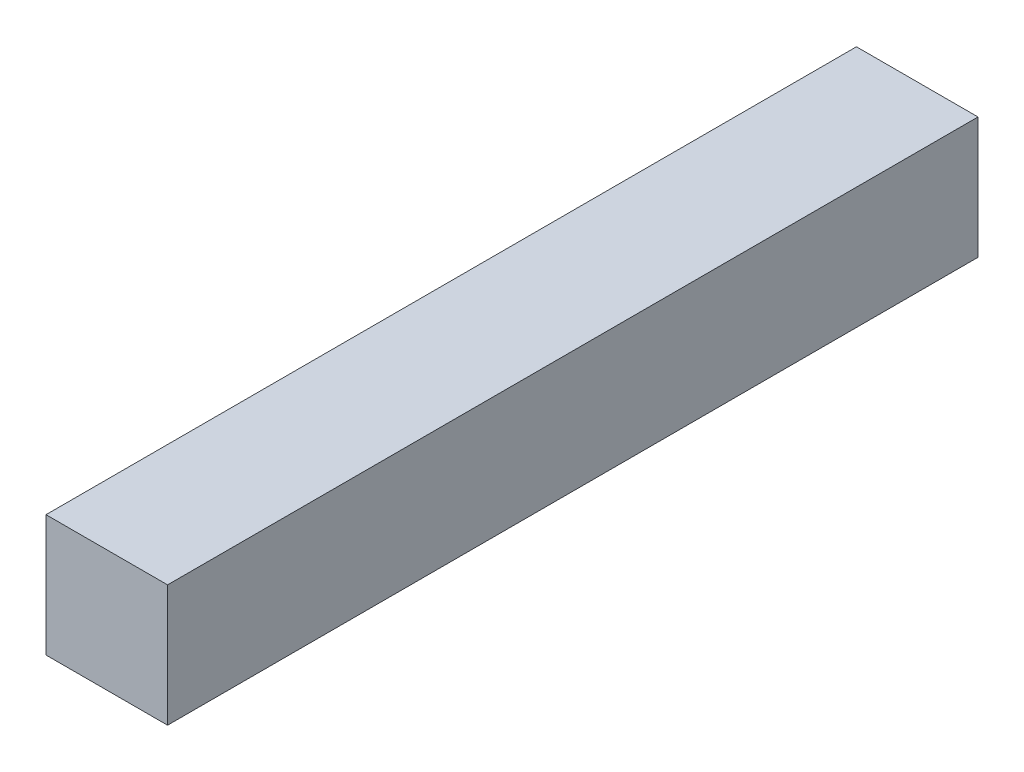
ISO-10303-21;
HEADER;
FILE_DESCRIPTION(('STEP AP214'),'2;1');
FILE_NAME('part.step','',(''),(''),'','','');
FILE_SCHEMA(('AUTOMOTIVE_DESIGN { 1 0 10303 214 1 1 1 1 }'));
ENDSEC;
DATA;
#1=APPLICATION_CONTEXT('core data for automotive mechanical design processes');
#2=APPLICATION_PROTOCOL_DEFINITION('international standard','automotive_design',2000,#1);
#3=PRODUCT_CONTEXT('',#1,'mechanical');
#4=PRODUCT('Part','Part','',(#3));
#5=PRODUCT_RELATED_PRODUCT_CATEGORY('part','',(#4));
#6=PRODUCT_DEFINITION_FORMATION('','',#4);
#7=PRODUCT_DEFINITION_CONTEXT('part definition',#1,'design');
#8=PRODUCT_DEFINITION('design','',#6,#7);
#9=PRODUCT_DEFINITION_SHAPE('','',#8);
#10=(LENGTH_UNIT() NAMED_UNIT(*) SI_UNIT(.MILLI.,.METRE.));
#11=(NAMED_UNIT(*) PLANE_ANGLE_UNIT() SI_UNIT($,.RADIAN.));
#12=(NAMED_UNIT(*) SI_UNIT($,.STERADIAN.) SOLID_ANGLE_UNIT());
#13=UNCERTAINTY_MEASURE_WITH_UNIT(LENGTH_MEASURE(1.E-05),#10,'distance_accuracy_value','');
#14=(GEOMETRIC_REPRESENTATION_CONTEXT(3) GLOBAL_UNCERTAINTY_ASSIGNED_CONTEXT((#13)) GLOBAL_UNIT_ASSIGNED_CONTEXT((#10,
#11,#12)) REPRESENTATION_CONTEXT('',''));
#15=CARTESIAN_POINT('',(0.,0.,0.));
#16=DIRECTION('',(0.,0.,1.));
#17=DIRECTION('',(1.,0.,0.));
#18=AXIS2_PLACEMENT_3D('',#15,#16,#17);
#19=CARTESIAN_POINT('',(2.38125,-2.38125,31.75));
#20=DIRECTION('',(-1.,0.,0.));
#21=DIRECTION('',(0.,0.,1.));
#22=AXIS2_PLACEMENT_3D('',#19,#20,#21);
#23=PLANE('',#22);
#24=DIRECTION('',(0.,1.,0.));
#25=VECTOR('',#24,1.);
#26=CARTESIAN_POINT('',(2.38125,-2.38125,0.));
#27=LINE('',#26,#25);
#28=CARTESIAN_POINT('',(2.38125,-2.38125,0.));
#29=VERTEX_POINT('',#28);
#30=CARTESIAN_POINT('',(2.38125,2.38125,0.));
#31=VERTEX_POINT('',#30);
#32=EDGE_CURVE('E96',#29,#31,#27,.T.);
#33=ORIENTED_EDGE('',*,*,#32,.T.);
#34=DIRECTION('',(0.,0.,-1.));
#35=VECTOR('',#34,1.);
#36=CARTESIAN_POINT('',(2.38125,2.38125,31.75));
#37=LINE('',#36,#35);
#38=CARTESIAN_POINT('',(2.38125,2.38125,31.75));
#39=VERTEX_POINT('',#38);
#40=EDGE_CURVE('E11',#39,#31,#37,.T.);
#41=ORIENTED_EDGE('',*,*,#40,.F.);
#42=DIRECTION('',(0.,1.,0.));
#43=VECTOR('',#42,1.);
#44=CARTESIAN_POINT('',(2.38125,-2.38125,31.75));
#45=LINE('',#44,#43);
#46=CARTESIAN_POINT('',(2.38125,-2.38125,31.75));
#47=VERTEX_POINT('',#46);
#48=EDGE_CURVE('E84',#47,#39,#45,.T.);
#49=ORIENTED_EDGE('',*,*,#48,.F.);
#50=DIRECTION('',(0.,0.,-1.));
#51=VECTOR('',#50,1.);
#52=CARTESIAN_POINT('',(2.38125,-2.38125,31.75));
#53=LINE('',#52,#51);
#54=EDGE_CURVE('E92',#47,#29,#53,.T.);
#55=ORIENTED_EDGE('',*,*,#54,.T.);
#56=EDGE_LOOP('',(#33,#41,#49,#55));
#57=FACE_BOUND('',#56,.T.);
#58=ADVANCED_FACE('F33',(#57),#23,.F.);
#59=CARTESIAN_POINT('',(-2.38125,2.38125,31.75));
#60=DIRECTION('',(0.,-1.,0.));
#61=DIRECTION('',(0.,0.,-1.));
#62=AXIS2_PLACEMENT_3D('',#59,#60,#61);
#63=PLANE('',#62);
#64=DIRECTION('',(-1.,0.,0.));
#65=VECTOR('',#64,1.);
#66=CARTESIAN_POINT('',(-2.38125,2.38125,0.));
#67=LINE('',#66,#65);
#68=CARTESIAN_POINT('',(-2.38125,2.38125,0.));
#69=VERTEX_POINT('',#68);
#70=EDGE_CURVE('E88',#31,#69,#67,.T.);
#71=ORIENTED_EDGE('',*,*,#70,.T.);
#72=DIRECTION('',(0.,0.,-1.));
#73=VECTOR('',#72,1.);
#74=CARTESIAN_POINT('',(-2.38125,2.38125,31.75));
#75=LINE('',#74,#73);
#76=CARTESIAN_POINT('',(-2.38125,2.38125,31.75));
#77=VERTEX_POINT('',#76);
#78=EDGE_CURVE('E41',#77,#69,#75,.T.);
#79=ORIENTED_EDGE('',*,*,#78,.F.);
#80=DIRECTION('',(-1.,0.,0.));
#81=VECTOR('',#80,1.);
#82=CARTESIAN_POINT('',(-2.38125,2.38125,31.75));
#83=LINE('',#82,#81);
#84=EDGE_CURVE('E79',#39,#77,#83,.T.);
#85=ORIENTED_EDGE('',*,*,#84,.F.);
#86=ORIENTED_EDGE('',*,*,#40,.T.);
#87=EDGE_LOOP('',(#71,#79,#85,#86));
#88=FACE_BOUND('',#87,.T.);
#89=ADVANCED_FACE('F87',(#88),#63,.F.);
#90=CARTESIAN_POINT('',(-2.38125,-2.38125,31.75));
#91=DIRECTION('',(1.,0.,0.));
#92=DIRECTION('',(0.,0.,-1.));
#93=AXIS2_PLACEMENT_3D('',#90,#91,#92);
#94=PLANE('',#93);
#95=DIRECTION('',(0.,-1.,0.));
#96=VECTOR('',#95,1.);
#97=CARTESIAN_POINT('',(-2.38125,-2.38125,0.));
#98=LINE('',#97,#96);
#99=CARTESIAN_POINT('',(-2.38125,-2.38125,0.));
#100=VERTEX_POINT('',#99);
#101=EDGE_CURVE('E66',#69,#100,#98,.T.);
#102=ORIENTED_EDGE('',*,*,#101,.T.);
#103=DIRECTION('',(0.,0.,-1.));
#104=VECTOR('',#103,1.);
#105=CARTESIAN_POINT('',(-2.38125,-2.38125,31.75));
#106=LINE('',#105,#104);
#107=CARTESIAN_POINT('',(-2.38125,-2.38125,31.75));
#108=VERTEX_POINT('',#107);
#109=EDGE_CURVE('E89',#108,#100,#106,.T.);
#110=ORIENTED_EDGE('',*,*,#109,.F.);
#111=DIRECTION('',(0.,-1.,0.));
#112=VECTOR('',#111,1.);
#113=CARTESIAN_POINT('',(-2.38125,-2.38125,31.75));
#114=LINE('',#113,#112);
#115=EDGE_CURVE('E82',#77,#108,#114,.T.);
#116=ORIENTED_EDGE('',*,*,#115,.F.);
#117=ORIENTED_EDGE('',*,*,#78,.T.);
#118=EDGE_LOOP('',(#102,#110,#116,#117));
#119=FACE_BOUND('',#118,.T.);
#120=ADVANCED_FACE('F90',(#119),#94,.F.);
#121=CARTESIAN_POINT('',(-2.38125,-2.38125,31.75));
#122=DIRECTION('',(0.,1.,0.));
#123=DIRECTION('',(0.,0.,1.));
#124=AXIS2_PLACEMENT_3D('',#121,#122,#123);
#125=PLANE('',#124);
#126=DIRECTION('',(1.,0.,0.));
#127=VECTOR('',#126,1.);
#128=CARTESIAN_POINT('',(-2.38125,-2.38125,0.));
#129=LINE('',#128,#127);
#130=EDGE_CURVE('E72',#100,#29,#129,.T.);
#131=ORIENTED_EDGE('',*,*,#130,.T.);
#132=ORIENTED_EDGE('',*,*,#54,.F.);
#133=DIRECTION('',(1.,0.,0.));
#134=VECTOR('',#133,1.);
#135=CARTESIAN_POINT('',(-2.38125,-2.38125,31.75));
#136=LINE('',#135,#134);
#137=EDGE_CURVE('E49',#108,#47,#136,.T.);
#138=ORIENTED_EDGE('',*,*,#137,.F.);
#139=ORIENTED_EDGE('',*,*,#109,.T.);
#140=EDGE_LOOP('',(#131,#132,#138,#139));
#141=FACE_BOUND('',#140,.T.);
#142=ADVANCED_FACE('F103',(#141),#125,.F.);
#143=CARTESIAN_POINT('',(0.,0.,31.75));
#144=DIRECTION('',(0.,0.,-1.));
#145=DIRECTION('',(-1.,0.,0.));
#146=AXIS2_PLACEMENT_3D('',#143,#144,#145);
#147=PLANE('',#146);
#148=ORIENTED_EDGE('',*,*,#48,.T.);
#149=ORIENTED_EDGE('',*,*,#84,.T.);
#150=ORIENTED_EDGE('',*,*,#115,.T.);
#151=ORIENTED_EDGE('',*,*,#137,.T.);
#152=EDGE_LOOP('',(#148,#149,#150,#151));
#153=FACE_BOUND('',#152,.T.);
#154=ADVANCED_FACE('F80',(#153),#147,.F.);
#155=CARTESIAN_POINT('',(0.,0.,0.));
#156=DIRECTION('',(0.,0.,-1.));
#157=DIRECTION('',(-1.,0.,0.));
#158=AXIS2_PLACEMENT_3D('',#155,#156,#157);
#159=PLANE('',#158);
#160=ORIENTED_EDGE('',*,*,#32,.F.);
#161=ORIENTED_EDGE('',*,*,#130,.F.);
#162=ORIENTED_EDGE('',*,*,#101,.F.);
#163=ORIENTED_EDGE('',*,*,#70,.F.);
#164=EDGE_LOOP('',(#160,#161,#162,#163));
#165=FACE_BOUND('',#164,.T.);
#166=ADVANCED_FACE('F106',(#165),#159,.T.);
#167=CLOSED_SHELL('',(#58,#89,#120,#142,#154,#166));
#168=MANIFOLD_SOLID_BREP('B2',#167);
#169=ADVANCED_BREP_SHAPE_REPRESENTATION('',(#18,#168),#14);
#170=SHAPE_DEFINITION_REPRESENTATION(#9,#169);
ENDSEC;
END-ISO-10303-21;
